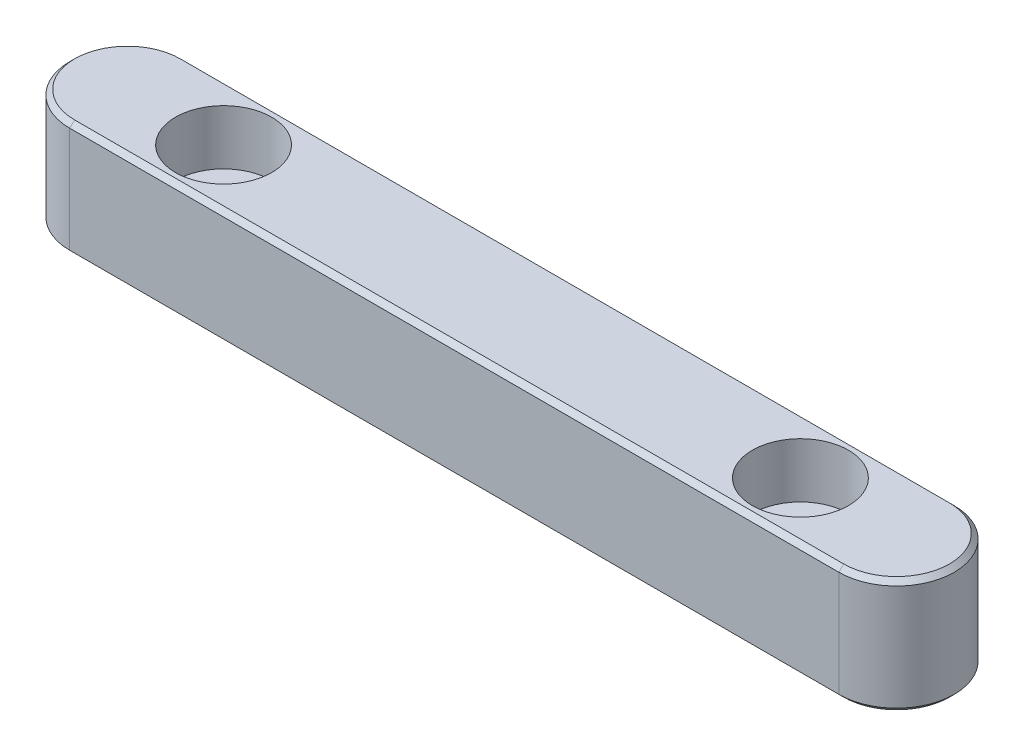
ISO-10303-21;
HEADER;
FILE_DESCRIPTION(('STEP AP214'),'2;1');
FILE_NAME('part.step','',(''),(''),'','','');
FILE_SCHEMA(('AUTOMOTIVE_DESIGN { 1 0 10303 214 1 1 1 1 }'));
ENDSEC;
DATA;
#1=APPLICATION_CONTEXT('core data for automotive mechanical design processes');
#2=APPLICATION_PROTOCOL_DEFINITION('international standard','automotive_design',2000,#1);
#3=PRODUCT_CONTEXT('',#1,'mechanical');
#4=PRODUCT('Part','Part','',(#3));
#5=PRODUCT_RELATED_PRODUCT_CATEGORY('part','',(#4));
#6=PRODUCT_DEFINITION_FORMATION('','',#4);
#7=PRODUCT_DEFINITION_CONTEXT('part definition',#1,'design');
#8=PRODUCT_DEFINITION('design','',#6,#7);
#9=PRODUCT_DEFINITION_SHAPE('','',#8);
#10=(LENGTH_UNIT() NAMED_UNIT(*) SI_UNIT(.MILLI.,.METRE.));
#11=(NAMED_UNIT(*) PLANE_ANGLE_UNIT() SI_UNIT($,.RADIAN.));
#12=(NAMED_UNIT(*) SI_UNIT($,.STERADIAN.) SOLID_ANGLE_UNIT());
#13=UNCERTAINTY_MEASURE_WITH_UNIT(LENGTH_MEASURE(1.E-05),#10,'distance_accuracy_value','');
#14=(GEOMETRIC_REPRESENTATION_CONTEXT(3) GLOBAL_UNCERTAINTY_ASSIGNED_CONTEXT((#13)) GLOBAL_UNIT_ASSIGNED_CONTEXT((#10,
#11,#12)) REPRESENTATION_CONTEXT('',''));
#15=CARTESIAN_POINT('',(0.,0.,0.));
#16=DIRECTION('',(0.,0.,1.));
#17=DIRECTION('',(1.,0.,0.));
#18=AXIS2_PLACEMENT_3D('',#15,#16,#17);
#19=CARTESIAN_POINT('',(-40.,12.,0.));
#20=DIRECTION('',(0.,-1.,0.));
#21=DIRECTION('',(0.,0.,-1.));
#22=AXIS2_PLACEMENT_3D('',#19,#20,#21);
#23=CYLINDRICAL_SURFACE('',#22,6.);
#24=DIRECTION('',(0.,-1.,0.));
#25=VECTOR('',#24,1.);
#26=CARTESIAN_POINT('',(-40.,12.,-6.));
#27=LINE('',#26,#25);
#28=CARTESIAN_POINT('',(-40.,11.5,-6.));
#29=VERTEX_POINT('',#28);
#30=CARTESIAN_POINT('',(-40.,0.500000000000011,-6.));
#31=VERTEX_POINT('',#30);
#32=EDGE_CURVE('E127',#29,#31,#27,.T.);
#33=ORIENTED_EDGE('',*,*,#32,.T.);
#34=CARTESIAN_POINT('',(-40.,0.500000000000011,0.));
#35=DIRECTION('',(0.,1.,0.));
#36=DIRECTION('',(0.,0.,1.));
#37=AXIS2_PLACEMENT_3D('',#34,#35,#36);
#38=CIRCLE('',#37,6.);
#39=CARTESIAN_POINT('',(-40.,0.500000000000011,6.));
#40=VERTEX_POINT('',#39);
#41=EDGE_CURVE('E136',#31,#40,#38,.T.);
#42=ORIENTED_EDGE('',*,*,#41,.T.);
#43=DIRECTION('',(0.,-1.,0.));
#44=VECTOR('',#43,1.);
#45=CARTESIAN_POINT('',(-40.,12.,6.));
#46=LINE('',#45,#44);
#47=CARTESIAN_POINT('',(-40.,11.5,6.));
#48=VERTEX_POINT('',#47);
#49=EDGE_CURVE('E104',#48,#40,#46,.T.);
#50=ORIENTED_EDGE('',*,*,#49,.F.);
#51=CARTESIAN_POINT('',(-40.,11.5,0.));
#52=DIRECTION('',(0.,1.,0.));
#53=DIRECTION('',(0.,0.,1.));
#54=AXIS2_PLACEMENT_3D('',#51,#52,#53);
#55=CIRCLE('',#54,6.);
#56=EDGE_CURVE('E138',#48,#29,#55,.F.);
#57=ORIENTED_EDGE('',*,*,#56,.T.);
#58=EDGE_LOOP('',(#33,#42,#50,#57));
#59=FACE_BOUND('',#58,.T.);
#60=ADVANCED_FACE('F17',(#59),#23,.T.);
#61=CARTESIAN_POINT('',(-40.,12.,6.));
#62=DIRECTION('',(0.,0.,-1.));
#63=DIRECTION('',(-1.,0.,0.));
#64=AXIS2_PLACEMENT_3D('',#61,#62,#63);
#65=PLANE('',#64);
#66=ORIENTED_EDGE('',*,*,#49,.T.);
#67=DIRECTION('',(1.,0.,0.));
#68=VECTOR('',#67,1.);
#69=CARTESIAN_POINT('',(-40.,0.500000000000011,6.));
#70=LINE('',#69,#68);
#71=CARTESIAN_POINT('',(40.,0.500000000000011,6.));
#72=VERTEX_POINT('',#71);
#73=EDGE_CURVE('E103',#40,#72,#70,.T.);
#74=ORIENTED_EDGE('',*,*,#73,.T.);
#75=DIRECTION('',(0.,-1.,0.));
#76=VECTOR('',#75,1.);
#77=CARTESIAN_POINT('',(40.,12.,6.));
#78=LINE('',#77,#76);
#79=CARTESIAN_POINT('',(40.,11.5,6.));
#80=VERTEX_POINT('',#79);
#81=EDGE_CURVE('E86',#80,#72,#78,.T.);
#82=ORIENTED_EDGE('',*,*,#81,.F.);
#83=DIRECTION('',(-1.,0.,0.));
#84=VECTOR('',#83,1.);
#85=CARTESIAN_POINT('',(-40.,11.5,6.));
#86=LINE('',#85,#84);
#87=EDGE_CURVE('E100',#80,#48,#86,.T.);
#88=ORIENTED_EDGE('',*,*,#87,.T.);
#89=EDGE_LOOP('',(#66,#74,#82,#88));
#90=FACE_BOUND('',#89,.T.);
#91=ADVANCED_FACE('F99',(#90),#65,.F.);
#92=CARTESIAN_POINT('',(40.,12.,0.));
#93=DIRECTION('',(0.,-1.,0.));
#94=DIRECTION('',(0.,0.,-1.));
#95=AXIS2_PLACEMENT_3D('',#92,#93,#94);
#96=CYLINDRICAL_SURFACE('',#95,6.);
#97=ORIENTED_EDGE('',*,*,#81,.T.);
#98=CARTESIAN_POINT('',(40.,0.500000000000011,0.));
#99=DIRECTION('',(0.,1.,0.));
#100=DIRECTION('',(0.,0.,1.));
#101=AXIS2_PLACEMENT_3D('',#98,#99,#100);
#102=CIRCLE('',#101,6.);
#103=CARTESIAN_POINT('',(40.,0.500000000000011,-6.));
#104=VERTEX_POINT('',#103);
#105=EDGE_CURVE('E92',#72,#104,#102,.T.);
#106=ORIENTED_EDGE('',*,*,#105,.T.);
#107=DIRECTION('',(0.,-1.,0.));
#108=VECTOR('',#107,1.);
#109=CARTESIAN_POINT('',(40.,12.,-6.));
#110=LINE('',#109,#108);
#111=CARTESIAN_POINT('',(40.,11.5,-6.));
#112=VERTEX_POINT('',#111);
#113=EDGE_CURVE('E88',#112,#104,#110,.T.);
#114=ORIENTED_EDGE('',*,*,#113,.F.);
#115=CARTESIAN_POINT('',(40.,11.5,0.));
#116=DIRECTION('',(0.,1.,0.));
#117=DIRECTION('',(0.,0.,1.));
#118=AXIS2_PLACEMENT_3D('',#115,#116,#117);
#119=CIRCLE('',#118,6.);
#120=EDGE_CURVE('E83',#112,#80,#119,.F.);
#121=ORIENTED_EDGE('',*,*,#120,.T.);
#122=EDGE_LOOP('',(#97,#106,#114,#121));
#123=FACE_BOUND('',#122,.T.);
#124=ADVANCED_FACE('F85',(#123),#96,.T.);
#125=CARTESIAN_POINT('',(-40.,12.,-6.));
#126=DIRECTION('',(0.,0.,1.));
#127=DIRECTION('',(1.,0.,0.));
#128=AXIS2_PLACEMENT_3D('',#125,#126,#127);
#129=PLANE('',#128);
#130=ORIENTED_EDGE('',*,*,#113,.T.);
#131=DIRECTION('',(-1.,0.,0.));
#132=VECTOR('',#131,1.);
#133=CARTESIAN_POINT('',(-40.,0.500000000000011,-6.));
#134=LINE('',#133,#132);
#135=EDGE_CURVE('E140',#104,#31,#134,.T.);
#136=ORIENTED_EDGE('',*,*,#135,.T.);
#137=ORIENTED_EDGE('',*,*,#32,.F.);
#138=DIRECTION('',(1.,0.,0.));
#139=VECTOR('',#138,1.);
#140=CARTESIAN_POINT('',(40.,11.5,-6.));
#141=LINE('',#140,#139);
#142=EDGE_CURVE('E142',#29,#112,#141,.T.);
#143=ORIENTED_EDGE('',*,*,#142,.T.);
#144=EDGE_LOOP('',(#130,#136,#137,#143));
#145=FACE_BOUND('',#144,.T.);
#146=ADVANCED_FACE('F188',(#145),#129,.F.);
#147=CARTESIAN_POINT('',(-40.,12.,0.));
#148=DIRECTION('',(0.,1.,0.));
#149=DIRECTION('',(0.,0.,1.));
#150=AXIS2_PLACEMENT_3D('',#147,#148,#149);
#151=PLANE('',#150);
#152=CARTESIAN_POINT('',(-30.,12.,0.));
#153=DIRECTION('',(0.,1.,0.));
#154=DIRECTION('',(0.,0.,1.));
#155=AXIS2_PLACEMENT_3D('',#152,#153,#154);
#156=CIRCLE('',#155,5.);
#157=CARTESIAN_POINT('',(-30.,12.,5.));
#158=VERTEX_POINT('',#157);
#159=EDGE_CURVE('E178',#158,#158,#156,.T.);
#160=ORIENTED_EDGE('',*,*,#159,.F.);
#161=EDGE_LOOP('',(#160));
#162=FACE_BOUND('',#161,.T.);
#163=CARTESIAN_POINT('',(30.,12.,0.));
#164=DIRECTION('',(0.,1.,0.));
#165=DIRECTION('',(0.,0.,1.));
#166=AXIS2_PLACEMENT_3D('',#163,#164,#165);
#167=CIRCLE('',#166,5.);
#168=CARTESIAN_POINT('',(30.,12.,5.));
#169=VERTEX_POINT('',#168);
#170=EDGE_CURVE('E166',#169,#169,#167,.T.);
#171=ORIENTED_EDGE('',*,*,#170,.F.);
#172=EDGE_LOOP('',(#171));
#173=FACE_BOUND('',#172,.T.);
#174=CARTESIAN_POINT('',(40.,12.,0.));
#175=DIRECTION('',(0.,1.,0.));
#176=DIRECTION('',(0.,0.,1.));
#177=AXIS2_PLACEMENT_3D('',#174,#175,#176);
#178=CIRCLE('',#177,5.5);
#179=CARTESIAN_POINT('',(40.,12.,5.5));
#180=VERTEX_POINT('',#179);
#181=CARTESIAN_POINT('',(40.,12.,-5.5));
#182=VERTEX_POINT('',#181);
#183=EDGE_CURVE('E26',#180,#182,#178,.T.);
#184=ORIENTED_EDGE('',*,*,#183,.T.);
#185=DIRECTION('',(-1.,0.,0.));
#186=VECTOR('',#185,1.);
#187=CARTESIAN_POINT('',(-40.,12.,-5.5));
#188=LINE('',#187,#186);
#189=CARTESIAN_POINT('',(-40.,12.,-5.5));
#190=VERTEX_POINT('',#189);
#191=EDGE_CURVE('E11',#182,#190,#188,.T.);
#192=ORIENTED_EDGE('',*,*,#191,.T.);
#193=CARTESIAN_POINT('',(-40.,12.,0.));
#194=DIRECTION('',(0.,1.,0.));
#195=DIRECTION('',(0.,0.,1.));
#196=AXIS2_PLACEMENT_3D('',#193,#194,#195);
#197=CIRCLE('',#196,5.5);
#198=CARTESIAN_POINT('',(-40.,12.,5.5));
#199=VERTEX_POINT('',#198);
#200=EDGE_CURVE('E134',#190,#199,#197,.T.);
#201=ORIENTED_EDGE('',*,*,#200,.T.);
#202=DIRECTION('',(1.,0.,0.));
#203=VECTOR('',#202,1.);
#204=CARTESIAN_POINT('',(40.,12.,5.5));
#205=LINE('',#204,#203);
#206=EDGE_CURVE('E37',#199,#180,#205,.T.);
#207=ORIENTED_EDGE('',*,*,#206,.T.);
#208=EDGE_LOOP('',(#184,#192,#201,#207));
#209=FACE_BOUND('',#208,.T.);
#210=ADVANCED_FACE('F184',(#162,#173,#209),#151,.T.);
#211=CARTESIAN_POINT('',(-40.,0.,0.));
#212=DIRECTION('',(0.,1.,0.));
#213=DIRECTION('',(0.,0.,1.));
#214=AXIS2_PLACEMENT_3D('',#211,#212,#213);
#215=PLANE('',#214);
#216=CARTESIAN_POINT('',(-30.,0.,0.));
#217=DIRECTION('',(0.,1.,0.));
#218=DIRECTION('',(0.,0.,1.));
#219=AXIS2_PLACEMENT_3D('',#216,#217,#218);
#220=CIRCLE('',#219,2.75);
#221=CARTESIAN_POINT('',(-30.,0.,2.75));
#222=VERTEX_POINT('',#221);
#223=EDGE_CURVE('E169',#222,#222,#220,.T.);
#224=ORIENTED_EDGE('',*,*,#223,.T.);
#225=EDGE_LOOP('',(#224));
#226=FACE_BOUND('',#225,.T.);
#227=CARTESIAN_POINT('',(30.,0.,0.));
#228=DIRECTION('',(0.,1.,0.));
#229=DIRECTION('',(0.,0.,1.));
#230=AXIS2_PLACEMENT_3D('',#227,#228,#229);
#231=CIRCLE('',#230,2.75);
#232=CARTESIAN_POINT('',(30.,0.,2.75));
#233=VERTEX_POINT('',#232);
#234=EDGE_CURVE('E123',#233,#233,#231,.T.);
#235=ORIENTED_EDGE('',*,*,#234,.T.);
#236=EDGE_LOOP('',(#235));
#237=FACE_BOUND('',#236,.T.);
#238=CARTESIAN_POINT('',(40.,0.,0.));
#239=DIRECTION('',(0.,1.,0.));
#240=DIRECTION('',(0.,0.,1.));
#241=AXIS2_PLACEMENT_3D('',#238,#239,#240);
#242=CIRCLE('',#241,5.5);
#243=CARTESIAN_POINT('',(40.,0.,-5.5));
#244=VERTEX_POINT('',#243);
#245=CARTESIAN_POINT('',(40.,0.,5.5));
#246=VERTEX_POINT('',#245);
#247=EDGE_CURVE('E147',#244,#246,#242,.F.);
#248=ORIENTED_EDGE('',*,*,#247,.T.);
#249=DIRECTION('',(-1.,0.,0.));
#250=VECTOR('',#249,1.);
#251=CARTESIAN_POINT('',(-40.,0.,5.5));
#252=LINE('',#251,#250);
#253=CARTESIAN_POINT('',(-40.,0.,5.5));
#254=VERTEX_POINT('',#253);
#255=EDGE_CURVE('E93',#246,#254,#252,.T.);
#256=ORIENTED_EDGE('',*,*,#255,.T.);
#257=CARTESIAN_POINT('',(-40.,0.,0.));
#258=DIRECTION('',(0.,1.,0.));
#259=DIRECTION('',(0.,0.,1.));
#260=AXIS2_PLACEMENT_3D('',#257,#258,#259);
#261=CIRCLE('',#260,5.5);
#262=CARTESIAN_POINT('',(-40.,0.,-5.5));
#263=VERTEX_POINT('',#262);
#264=EDGE_CURVE('E151',#254,#263,#261,.F.);
#265=ORIENTED_EDGE('',*,*,#264,.T.);
#266=DIRECTION('',(1.,0.,0.));
#267=VECTOR('',#266,1.);
#268=CARTESIAN_POINT('',(-40.,0.,-5.5));
#269=LINE('',#268,#267);
#270=EDGE_CURVE('E149',#263,#244,#269,.T.);
#271=ORIENTED_EDGE('',*,*,#270,.T.);
#272=EDGE_LOOP('',(#248,#256,#265,#271));
#273=FACE_BOUND('',#272,.T.);
#274=ADVANCED_FACE('F187',(#226,#237,#273),#215,.F.);
#275=CARTESIAN_POINT('',(-40.,0.500000000000011,-6.));
#276=DIRECTION('',(0.,0.707106781186555,0.70710678118654));
#277=DIRECTION('',(-1.,0.,0.));
#278=AXIS2_PLACEMENT_3D('',#275,#276,#277);
#279=PLANE('',#278);
#280=DIRECTION('',(0.,0.70710678118654,-0.707106781186555));
#281=VECTOR('',#280,1.);
#282=CARTESIAN_POINT('',(40.,0.,-5.5));
#283=LINE('',#282,#281);
#284=EDGE_CURVE('E128',#244,#104,#283,.T.);
#285=ORIENTED_EDGE('',*,*,#284,.F.);
#286=ORIENTED_EDGE('',*,*,#270,.F.);
#287=DIRECTION('',(0.,-0.70710678118654,0.707106781186555));
#288=VECTOR('',#287,1.);
#289=CARTESIAN_POINT('',(-40.,0.500000000000011,-6.));
#290=LINE('',#289,#288);
#291=EDGE_CURVE('E124',#31,#263,#290,.T.);
#292=ORIENTED_EDGE('',*,*,#291,.F.);
#293=ORIENTED_EDGE('',*,*,#135,.F.);
#294=EDGE_LOOP('',(#285,#286,#292,#293));
#295=FACE_BOUND('',#294,.T.);
#296=ADVANCED_FACE('F232',(#295),#279,.F.);
#297=CARTESIAN_POINT('',(-40.,0.500000000000011,0.));
#298=DIRECTION('',(0.,1.,0.));
#299=DIRECTION('',(0.,0.,1.));
#300=AXIS2_PLACEMENT_3D('',#297,#298,#299);
#301=CONICAL_SURFACE('',#300,6.,0.785398163397459);
#302=ORIENTED_EDGE('',*,*,#291,.T.);
#303=ORIENTED_EDGE('',*,*,#264,.F.);
#304=DIRECTION('',(0.,-0.70710678118654,-0.707106781186555));
#305=VECTOR('',#304,1.);
#306=CARTESIAN_POINT('',(-40.,0.500000000000011,6.));
#307=LINE('',#306,#305);
#308=EDGE_CURVE('E114',#40,#254,#307,.T.);
#309=ORIENTED_EDGE('',*,*,#308,.F.);
#310=ORIENTED_EDGE('',*,*,#41,.F.);
#311=EDGE_LOOP('',(#302,#303,#309,#310));
#312=FACE_BOUND('',#311,.T.);
#313=ADVANCED_FACE('F228',(#312),#301,.T.);
#314=CARTESIAN_POINT('',(40.,0.500000000000011,0.));
#315=DIRECTION('',(0.,1.,0.));
#316=DIRECTION('',(0.,0.,1.));
#317=AXIS2_PLACEMENT_3D('',#314,#315,#316);
#318=CONICAL_SURFACE('',#317,6.,0.785398163397459);
#319=ORIENTED_EDGE('',*,*,#284,.T.);
#320=ORIENTED_EDGE('',*,*,#105,.F.);
#321=DIRECTION('',(0.,0.70710678118654,0.707106781186555));
#322=VECTOR('',#321,1.);
#323=CARTESIAN_POINT('',(40.,0.,5.5));
#324=LINE('',#323,#322);
#325=EDGE_CURVE('E113',#246,#72,#324,.T.);
#326=ORIENTED_EDGE('',*,*,#325,.F.);
#327=ORIENTED_EDGE('',*,*,#247,.F.);
#328=EDGE_LOOP('',(#319,#320,#326,#327));
#329=FACE_BOUND('',#328,.T.);
#330=ADVANCED_FACE('F224',(#329),#318,.T.);
#331=CARTESIAN_POINT('',(-40.,0.500000000000011,6.));
#332=DIRECTION('',(0.,0.707106781186555,-0.70710678118654));
#333=DIRECTION('',(1.,0.,0.));
#334=AXIS2_PLACEMENT_3D('',#331,#332,#333);
#335=PLANE('',#334);
#336=ORIENTED_EDGE('',*,*,#308,.T.);
#337=ORIENTED_EDGE('',*,*,#255,.F.);
#338=ORIENTED_EDGE('',*,*,#325,.T.);
#339=ORIENTED_EDGE('',*,*,#73,.F.);
#340=EDGE_LOOP('',(#336,#337,#338,#339));
#341=FACE_BOUND('',#340,.T.);
#342=ADVANCED_FACE('F221',(#341),#335,.F.);
#343=CARTESIAN_POINT('',(-40.,12.,5.5));
#344=DIRECTION('',(0.,0.70710678118655,0.707106781186545));
#345=DIRECTION('',(-1.,0.,0.));
#346=AXIS2_PLACEMENT_3D('',#343,#344,#345);
#347=PLANE('',#346);
#348=DIRECTION('',(0.,0.707106781186545,-0.70710678118655));
#349=VECTOR('',#348,1.);
#350=CARTESIAN_POINT('',(-40.,11.5,6.));
#351=LINE('',#350,#349);
#352=EDGE_CURVE('E109',#48,#199,#351,.T.);
#353=ORIENTED_EDGE('',*,*,#352,.F.);
#354=ORIENTED_EDGE('',*,*,#87,.F.);
#355=DIRECTION('',(0.,-0.707106781186545,0.70710678118655));
#356=VECTOR('',#355,1.);
#357=CARTESIAN_POINT('',(40.,12.,5.5));
#358=LINE('',#357,#356);
#359=EDGE_CURVE('E21',#180,#80,#358,.T.);
#360=ORIENTED_EDGE('',*,*,#359,.F.);
#361=ORIENTED_EDGE('',*,*,#206,.F.);
#362=EDGE_LOOP('',(#353,#354,#360,#361));
#363=FACE_BOUND('',#362,.T.);
#364=ADVANCED_FACE('F19',(#363),#347,.T.);
#365=CARTESIAN_POINT('',(40.,12.,0.));
#366=DIRECTION('',(0.,-1.,0.));
#367=DIRECTION('',(0.,0.,-1.));
#368=AXIS2_PLACEMENT_3D('',#365,#366,#367);
#369=CONICAL_SURFACE('',#368,5.5,0.785398163397452);
#370=ORIENTED_EDGE('',*,*,#359,.T.);
#371=ORIENTED_EDGE('',*,*,#120,.F.);
#372=DIRECTION('',(0.,-0.707106781186545,-0.70710678118655));
#373=VECTOR('',#372,1.);
#374=CARTESIAN_POINT('',(40.,12.,-5.5));
#375=LINE('',#374,#373);
#376=EDGE_CURVE('E116',#182,#112,#375,.T.);
#377=ORIENTED_EDGE('',*,*,#376,.F.);
#378=ORIENTED_EDGE('',*,*,#183,.F.);
#379=EDGE_LOOP('',(#370,#371,#377,#378));
#380=FACE_BOUND('',#379,.T.);
#381=ADVANCED_FACE('F112',(#380),#369,.T.);
#382=CARTESIAN_POINT('',(-40.,12.,0.));
#383=DIRECTION('',(0.,-1.,0.));
#384=DIRECTION('',(0.,0.,-1.));
#385=AXIS2_PLACEMENT_3D('',#382,#383,#384);
#386=CONICAL_SURFACE('',#385,5.5,0.785398163397452);
#387=ORIENTED_EDGE('',*,*,#352,.T.);
#388=ORIENTED_EDGE('',*,*,#200,.F.);
#389=DIRECTION('',(0.,0.707106781186545,0.70710678118655));
#390=VECTOR('',#389,1.);
#391=CARTESIAN_POINT('',(-40.,11.5,-6.));
#392=LINE('',#391,#390);
#393=EDGE_CURVE('E119',#29,#190,#392,.T.);
#394=ORIENTED_EDGE('',*,*,#393,.F.);
#395=ORIENTED_EDGE('',*,*,#56,.F.);
#396=EDGE_LOOP('',(#387,#388,#394,#395));
#397=FACE_BOUND('',#396,.T.);
#398=ADVANCED_FACE('F240',(#397),#386,.T.);
#399=CARTESIAN_POINT('',(-40.,12.,-5.5));
#400=DIRECTION('',(0.,0.70710678118655,-0.707106781186545));
#401=DIRECTION('',(1.,0.,0.));
#402=AXIS2_PLACEMENT_3D('',#399,#400,#401);
#403=PLANE('',#402);
#404=ORIENTED_EDGE('',*,*,#376,.T.);
#405=ORIENTED_EDGE('',*,*,#142,.F.);
#406=ORIENTED_EDGE('',*,*,#393,.T.);
#407=ORIENTED_EDGE('',*,*,#191,.F.);
#408=EDGE_LOOP('',(#404,#405,#406,#407));
#409=FACE_BOUND('',#408,.T.);
#410=ADVANCED_FACE('F237',(#409),#403,.T.);
#411=CARTESIAN_POINT('',(30.,12.,0.));
#412=DIRECTION('',(0.,1.,0.));
#413=DIRECTION('',(0.,0.,1.));
#414=AXIS2_PLACEMENT_3D('',#411,#412,#413);
#415=CYLINDRICAL_SURFACE('',#414,2.75);
#416=ORIENTED_EDGE('',*,*,#234,.F.);
#417=EDGE_LOOP('',(#416));
#418=FACE_BOUND('',#417,.T.);
#419=CARTESIAN_POINT('',(30.,6.3,0.));
#420=DIRECTION('',(0.,1.,0.));
#421=DIRECTION('',(0.,0.,1.));
#422=AXIS2_PLACEMENT_3D('',#419,#420,#421);
#423=CIRCLE('',#422,2.75);
#424=CARTESIAN_POINT('',(30.,6.3,2.75));
#425=VERTEX_POINT('',#424);
#426=EDGE_CURVE('E160',#425,#425,#423,.T.);
#427=ORIENTED_EDGE('',*,*,#426,.T.);
#428=EDGE_LOOP('',(#427));
#429=FACE_BOUND('',#428,.T.);
#430=ADVANCED_FACE('F207',(#418,#429),#415,.F.);
#431=CARTESIAN_POINT('',(32.75,6.3,0.));
#432=DIRECTION('',(0.,-1.,0.));
#433=DIRECTION('',(0.,0.,-1.));
#434=AXIS2_PLACEMENT_3D('',#431,#432,#433);
#435=PLANE('',#434);
#436=ORIENTED_EDGE('',*,*,#426,.F.);
#437=EDGE_LOOP('',(#436));
#438=FACE_BOUND('',#437,.T.);
#439=CARTESIAN_POINT('',(30.,6.3,0.));
#440=DIRECTION('',(0.,1.,0.));
#441=DIRECTION('',(0.,0.,1.));
#442=AXIS2_PLACEMENT_3D('',#439,#440,#441);
#443=CIRCLE('',#442,5.);
#444=CARTESIAN_POINT('',(30.,6.3,5.));
#445=VERTEX_POINT('',#444);
#446=EDGE_CURVE('E163',#445,#445,#443,.T.);
#447=ORIENTED_EDGE('',*,*,#446,.T.);
#448=EDGE_LOOP('',(#447));
#449=FACE_BOUND('',#448,.T.);
#450=ADVANCED_FACE('F195',(#438,#449),#435,.F.);
#451=CARTESIAN_POINT('',(30.,12.,0.));
#452=DIRECTION('',(0.,1.,0.));
#453=DIRECTION('',(0.,0.,1.));
#454=AXIS2_PLACEMENT_3D('',#451,#452,#453);
#455=CYLINDRICAL_SURFACE('',#454,5.);
#456=ORIENTED_EDGE('',*,*,#446,.F.);
#457=EDGE_LOOP('',(#456));
#458=FACE_BOUND('',#457,.T.);
#459=ORIENTED_EDGE('',*,*,#170,.T.);
#460=EDGE_LOOP('',(#459));
#461=FACE_BOUND('',#460,.T.);
#462=ADVANCED_FACE('F192',(#458,#461),#455,.F.);
#463=CARTESIAN_POINT('',(-30.,12.,0.));
#464=DIRECTION('',(0.,1.,0.));
#465=DIRECTION('',(0.,0.,1.));
#466=AXIS2_PLACEMENT_3D('',#463,#464,#465);
#467=CYLINDRICAL_SURFACE('',#466,2.75);
#468=ORIENTED_EDGE('',*,*,#223,.F.);
#469=EDGE_LOOP('',(#468));
#470=FACE_BOUND('',#469,.T.);
#471=CARTESIAN_POINT('',(-30.,6.3,0.));
#472=DIRECTION('',(0.,1.,0.));
#473=DIRECTION('',(0.,0.,1.));
#474=AXIS2_PLACEMENT_3D('',#471,#472,#473);
#475=CIRCLE('',#474,2.75);
#476=CARTESIAN_POINT('',(-30.,6.3,2.75));
#477=VERTEX_POINT('',#476);
#478=EDGE_CURVE('E172',#477,#477,#475,.T.);
#479=ORIENTED_EDGE('',*,*,#478,.T.);
#480=EDGE_LOOP('',(#479));
#481=FACE_BOUND('',#480,.T.);
#482=ADVANCED_FACE('F194',(#470,#481),#467,.F.);
#483=CARTESIAN_POINT('',(-27.25,6.3,0.));
#484=DIRECTION('',(0.,-1.,0.));
#485=DIRECTION('',(0.,0.,-1.));
#486=AXIS2_PLACEMENT_3D('',#483,#484,#485);
#487=PLANE('',#486);
#488=ORIENTED_EDGE('',*,*,#478,.F.);
#489=EDGE_LOOP('',(#488));
#490=FACE_BOUND('',#489,.T.);
#491=CARTESIAN_POINT('',(-30.,6.3,0.));
#492=DIRECTION('',(0.,1.,0.));
#493=DIRECTION('',(0.,0.,1.));
#494=AXIS2_PLACEMENT_3D('',#491,#492,#493);
#495=CIRCLE('',#494,5.);
#496=CARTESIAN_POINT('',(-30.,6.3,5.));
#497=VERTEX_POINT('',#496);
#498=EDGE_CURVE('E175',#497,#497,#495,.T.);
#499=ORIENTED_EDGE('',*,*,#498,.T.);
#500=EDGE_LOOP('',(#499));
#501=FACE_BOUND('',#500,.T.);
#502=ADVANCED_FACE('F204',(#490,#501),#487,.F.);
#503=CARTESIAN_POINT('',(-30.,12.,0.));
#504=DIRECTION('',(0.,1.,0.));
#505=DIRECTION('',(0.,0.,1.));
#506=AXIS2_PLACEMENT_3D('',#503,#504,#505);
#507=CYLINDRICAL_SURFACE('',#506,5.);
#508=ORIENTED_EDGE('',*,*,#498,.F.);
#509=EDGE_LOOP('',(#508));
#510=FACE_BOUND('',#509,.T.);
#511=ORIENTED_EDGE('',*,*,#159,.T.);
#512=EDGE_LOOP('',(#511));
#513=FACE_BOUND('',#512,.T.);
#514=ADVANCED_FACE('F182',(#510,#513),#507,.F.);
#515=CLOSED_SHELL('',(#60,#91,#124,#146,#210,#274,#296,#313,#330,#342,#364,#381,#398,#410,#430,
#450,#462,#482,#502,#514));
#516=MANIFOLD_SOLID_BREP('B1',#515);
#517=ADVANCED_BREP_SHAPE_REPRESENTATION('',(#18,#516),#14);
#518=SHAPE_DEFINITION_REPRESENTATION(#9,#517);
ENDSEC;
END-ISO-10303-21;
